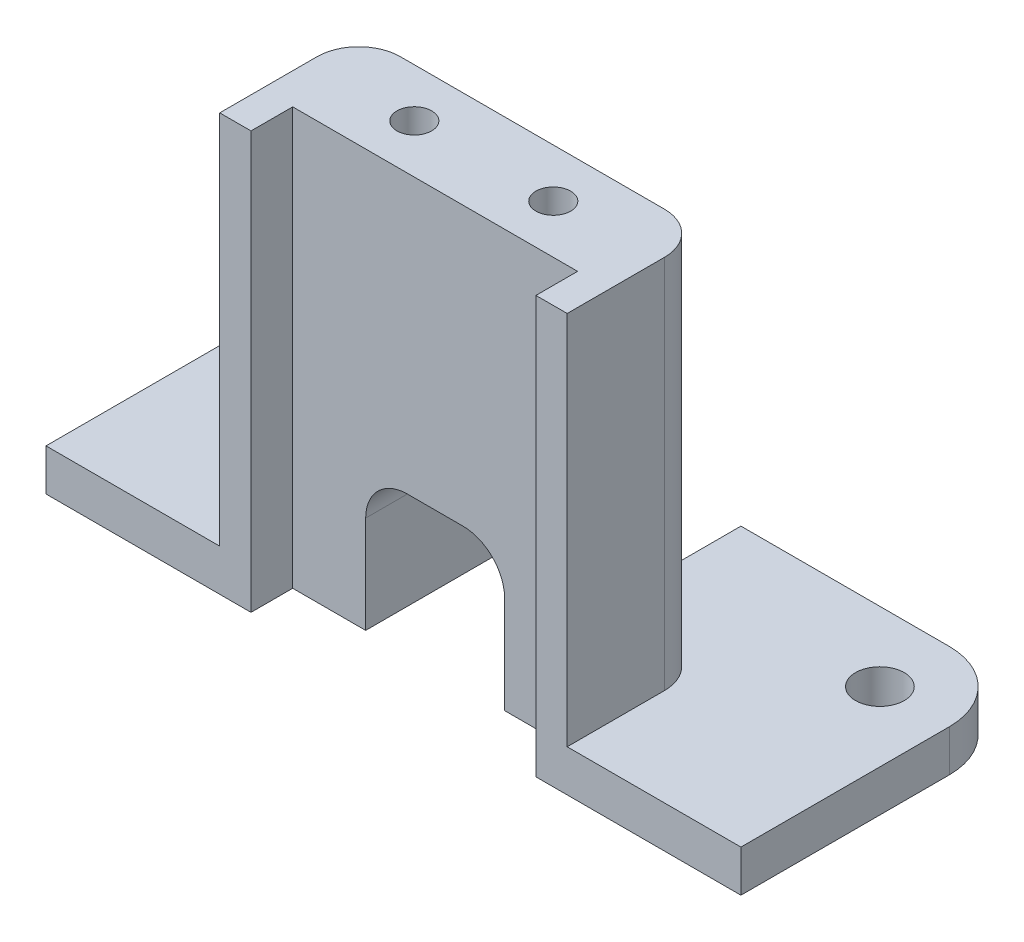
ISO-10303-21;
HEADER;
FILE_DESCRIPTION(('STEP AP214'),'2;1');
FILE_NAME('part.step','',(''),(''),'','','');
FILE_SCHEMA(('AUTOMOTIVE_DESIGN { 1 0 10303 214 1 1 1 1 }'));
ENDSEC;
DATA;
#1=APPLICATION_CONTEXT('core data for automotive mechanical design processes');
#2=APPLICATION_PROTOCOL_DEFINITION('international standard','automotive_design',2000,#1);
#3=PRODUCT_CONTEXT('',#1,'mechanical');
#4=PRODUCT('Part','Part','',(#3));
#5=PRODUCT_RELATED_PRODUCT_CATEGORY('part','',(#4));
#6=PRODUCT_DEFINITION_FORMATION('','',#4);
#7=PRODUCT_DEFINITION_CONTEXT('part definition',#1,'design');
#8=PRODUCT_DEFINITION('design','',#6,#7);
#9=PRODUCT_DEFINITION_SHAPE('','',#8);
#10=(LENGTH_UNIT() NAMED_UNIT(*) SI_UNIT(.MILLI.,.METRE.));
#11=(NAMED_UNIT(*) PLANE_ANGLE_UNIT() SI_UNIT($,.RADIAN.));
#12=(NAMED_UNIT(*) SI_UNIT($,.STERADIAN.) SOLID_ANGLE_UNIT());
#13=UNCERTAINTY_MEASURE_WITH_UNIT(LENGTH_MEASURE(1.E-05),#10,'distance_accuracy_value','');
#14=(GEOMETRIC_REPRESENTATION_CONTEXT(3) GLOBAL_UNCERTAINTY_ASSIGNED_CONTEXT((#13)) GLOBAL_UNIT_ASSIGNED_CONTEXT((#10,
#11,#12)) REPRESENTATION_CONTEXT('',''));
#15=CARTESIAN_POINT('',(0.,0.,0.));
#16=DIRECTION('',(0.,0.,1.));
#17=DIRECTION('',(1.,0.,0.));
#18=AXIS2_PLACEMENT_3D('',#15,#16,#17);
#19=CARTESIAN_POINT('',(0.,0.,0.));
#20=DIRECTION('',(0.,0.,-1.));
#21=DIRECTION('',(-1.,0.,0.));
#22=AXIS2_PLACEMENT_3D('',#19,#20,#21);
#23=PLANE('',#22);
#24=DIRECTION('',(0.,1.,0.));
#25=VECTOR('',#24,1.);
#26=CARTESIAN_POINT('',(7.49999999999999,0.,0.));
#27=LINE('',#26,#25);
#28=CARTESIAN_POINT('',(7.49999999999999,3.,0.));
#29=VERTEX_POINT('',#28);
#30=CARTESIAN_POINT('',(7.49999999999999,7.,0.));
#31=VERTEX_POINT('',#30);
#32=EDGE_CURVE('E346',#29,#31,#27,.T.);
#33=ORIENTED_EDGE('',*,*,#32,.F.);
#34=DIRECTION('',(1.,0.,0.));
#35=VECTOR('',#34,1.);
#36=CARTESIAN_POINT('',(0.,3.,0.));
#37=LINE('',#36,#35);
#38=CARTESIAN_POINT('',(3.,3.,0.));
#39=VERTEX_POINT('',#38);
#40=EDGE_CURVE('E567',#39,#29,#37,.T.);
#41=ORIENTED_EDGE('',*,*,#40,.F.);
#42=DIRECTION('',(0.,-1.,0.));
#43=VECTOR('',#42,1.);
#44=CARTESIAN_POINT('',(2.99999999999999,30.,0.));
#45=LINE('',#44,#43);
#46=CARTESIAN_POINT('',(2.99999999999999,30.,0.));
#47=VERTEX_POINT('',#46);
#48=EDGE_CURVE('E273',#39,#47,#45,.F.);
#49=ORIENTED_EDGE('',*,*,#48,.T.);
#50=DIRECTION('',(-1.,0.,0.));
#51=VECTOR('',#50,1.);
#52=CARTESIAN_POINT('',(0.,30.,0.));
#53=LINE('',#52,#51);
#54=CARTESIAN_POINT('',(22.,30.,0.));
#55=VERTEX_POINT('',#54);
#56=EDGE_CURVE('E231',#55,#47,#53,.T.);
#57=ORIENTED_EDGE('',*,*,#56,.F.);
#58=DIRECTION('',(0.,1.,0.));
#59=VECTOR('',#58,1.);
#60=CARTESIAN_POINT('',(22.,0.,0.));
#61=LINE('',#60,#59);
#62=CARTESIAN_POINT('',(22.,3.,0.));
#63=VERTEX_POINT('',#62);
#64=EDGE_CURVE('E270',#55,#63,#61,.F.);
#65=ORIENTED_EDGE('',*,*,#64,.T.);
#66=DIRECTION('',(-1.,0.,0.));
#67=VECTOR('',#66,1.);
#68=CARTESIAN_POINT('',(0.,3.,0.));
#69=LINE('',#68,#67);
#70=CARTESIAN_POINT('',(17.5,3.,0.));
#71=VERTEX_POINT('',#70);
#72=EDGE_CURVE('E336',#63,#71,#69,.T.);
#73=ORIENTED_EDGE('',*,*,#72,.T.);
#74=DIRECTION('',(0.,-1.,0.));
#75=VECTOR('',#74,1.);
#76=CARTESIAN_POINT('',(17.5,0.,0.));
#77=LINE('',#76,#75);
#78=CARTESIAN_POINT('',(17.5,7.,0.));
#79=VERTEX_POINT('',#78);
#80=EDGE_CURVE('E343',#79,#71,#77,.T.);
#81=ORIENTED_EDGE('',*,*,#80,.F.);
#82=CARTESIAN_POINT('',(14.5,7.,0.));
#83=DIRECTION('',(0.,0.,-1.));
#84=DIRECTION('',(-1.,0.,0.));
#85=AXIS2_PLACEMENT_3D('',#82,#83,#84);
#86=CIRCLE('',#85,3.);
#87=CARTESIAN_POINT('',(14.5,10.,0.));
#88=VERTEX_POINT('',#87);
#89=EDGE_CURVE('E286',#79,#88,#86,.F.);
#90=ORIENTED_EDGE('',*,*,#89,.T.);
#91=DIRECTION('',(1.,0.,0.));
#92=VECTOR('',#91,1.);
#93=CARTESIAN_POINT('',(17.5,10.,0.));
#94=LINE('',#93,#92);
#95=CARTESIAN_POINT('',(10.5,10.,0.));
#96=VERTEX_POINT('',#95);
#97=EDGE_CURVE('E348',#96,#88,#94,.T.);
#98=ORIENTED_EDGE('',*,*,#97,.F.);
#99=CARTESIAN_POINT('',(10.5,7.,0.));
#100=DIRECTION('',(0.,0.,-1.));
#101=DIRECTION('',(-1.,0.,0.));
#102=AXIS2_PLACEMENT_3D('',#99,#100,#101);
#103=CIRCLE('',#102,3.);
#104=EDGE_CURVE('E281',#96,#31,#103,.F.);
#105=ORIENTED_EDGE('',*,*,#104,.T.);
#106=EDGE_LOOP('',(#33,#41,#49,#57,#65,#73,#81,#90,#98,#105));
#107=FACE_BOUND('',#106,.T.);
#108=ADVANCED_FACE('F41',(#107),#23,.T.);
#109=CARTESIAN_POINT('',(0.,0.,10.));
#110=DIRECTION('',(1.,0.,0.));
#111=DIRECTION('',(0.,1.,0.));
#112=AXIS2_PLACEMENT_3D('',#109,#110,#111);
#113=PLANE('',#112);
#114=DIRECTION('',(0.,0.,-1.));
#115=VECTOR('',#114,1.);
#116=CARTESIAN_POINT('',(0.,3.,0.));
#117=LINE('',#116,#115);
#118=CARTESIAN_POINT('',(0.,3.,10.));
#119=VERTEX_POINT('',#118);
#120=CARTESIAN_POINT('',(0.,3.,3.));
#121=VERTEX_POINT('',#120);
#122=EDGE_CURVE('E206',#119,#121,#117,.T.);
#123=ORIENTED_EDGE('',*,*,#122,.F.);
#124=DIRECTION('',(0.,-1.,0.));
#125=VECTOR('',#124,1.);
#126=CARTESIAN_POINT('',(0.,0.,10.));
#127=LINE('',#126,#125);
#128=CARTESIAN_POINT('',(0.,30.,10.));
#129=VERTEX_POINT('',#128);
#130=EDGE_CURVE('E219',#129,#119,#127,.T.);
#131=ORIENTED_EDGE('',*,*,#130,.F.);
#132=DIRECTION('',(0.,0.,-1.));
#133=VECTOR('',#132,1.);
#134=CARTESIAN_POINT('',(0.,30.,10.));
#135=LINE('',#134,#133);
#136=CARTESIAN_POINT('',(0.,30.,3.));
#137=VERTEX_POINT('',#136);
#138=EDGE_CURVE('E246',#129,#137,#135,.T.);
#139=ORIENTED_EDGE('',*,*,#138,.T.);
#140=DIRECTION('',(0.,-1.,0.));
#141=VECTOR('',#140,1.);
#142=CARTESIAN_POINT('',(0.,0.,3.));
#143=LINE('',#142,#141);
#144=EDGE_CURVE('E221',#137,#121,#143,.T.);
#145=ORIENTED_EDGE('',*,*,#144,.T.);
#146=EDGE_LOOP('',(#123,#131,#139,#145));
#147=FACE_BOUND('',#146,.T.);
#148=ADVANCED_FACE('F217',(#147),#113,.F.);
#149=CARTESIAN_POINT('',(3.,0.,3.));
#150=DIRECTION('',(0.,1.,0.));
#151=DIRECTION('',(-1.,0.,0.));
#152=AXIS2_PLACEMENT_3D('',#149,#150,#151);
#153=CYLINDRICAL_SURFACE('',#152,3.);
#154=ORIENTED_EDGE('',*,*,#48,.F.);
#155=CARTESIAN_POINT('',(3.,3.,3.));
#156=DIRECTION('',(0.,-1.,0.));
#157=DIRECTION('',(0.,0.,-1.));
#158=AXIS2_PLACEMENT_3D('',#155,#156,#157);
#159=CIRCLE('',#158,3.);
#160=EDGE_CURVE('E399',#121,#39,#159,.T.);
#161=ORIENTED_EDGE('',*,*,#160,.F.);
#162=ORIENTED_EDGE('',*,*,#144,.F.);
#163=CARTESIAN_POINT('',(2.99999999999999,30.,3.));
#164=DIRECTION('',(0.,-1.,0.));
#165=DIRECTION('',(0.,0.,-1.));
#166=AXIS2_PLACEMENT_3D('',#163,#164,#165);
#167=CIRCLE('',#166,3.);
#168=EDGE_CURVE('E277',#47,#137,#167,.F.);
#169=ORIENTED_EDGE('',*,*,#168,.F.);
#170=EDGE_LOOP('',(#154,#161,#162,#169));
#171=FACE_BOUND('',#170,.T.);
#172=ADVANCED_FACE('F439',(#171),#153,.T.);
#173=CARTESIAN_POINT('',(25.,0.,10.));
#174=DIRECTION('',(-1.,0.,0.));
#175=DIRECTION('',(0.,-1.,0.));
#176=AXIS2_PLACEMENT_3D('',#173,#174,#175);
#177=PLANE('',#176);
#178=DIRECTION('',(0.,0.,1.));
#179=VECTOR('',#178,1.);
#180=CARTESIAN_POINT('',(25.,3.,10.));
#181=LINE('',#180,#179);
#182=CARTESIAN_POINT('',(25.,3.,3.));
#183=VERTEX_POINT('',#182);
#184=CARTESIAN_POINT('',(25.,3.,10.));
#185=VERTEX_POINT('',#184);
#186=EDGE_CURVE('E341',#183,#185,#181,.T.);
#187=ORIENTED_EDGE('',*,*,#186,.F.);
#188=DIRECTION('',(0.,1.,0.));
#189=VECTOR('',#188,1.);
#190=CARTESIAN_POINT('',(25.,30.,3.));
#191=LINE('',#190,#189);
#192=CARTESIAN_POINT('',(25.,30.,3.));
#193=VERTEX_POINT('',#192);
#194=EDGE_CURVE('E279',#183,#193,#191,.T.);
#195=ORIENTED_EDGE('',*,*,#194,.T.);
#196=DIRECTION('',(0.,0.,-1.));
#197=VECTOR('',#196,1.);
#198=CARTESIAN_POINT('',(25.,30.,10.));
#199=LINE('',#198,#197);
#200=CARTESIAN_POINT('',(25.,30.,10.));
#201=VERTEX_POINT('',#200);
#202=EDGE_CURVE('E249',#201,#193,#199,.T.);
#203=ORIENTED_EDGE('',*,*,#202,.F.);
#204=DIRECTION('',(0.,1.,0.));
#205=VECTOR('',#204,1.);
#206=CARTESIAN_POINT('',(25.,0.,10.));
#207=LINE('',#206,#205);
#208=EDGE_CURVE('E242',#185,#201,#207,.T.);
#209=ORIENTED_EDGE('',*,*,#208,.F.);
#210=EDGE_LOOP('',(#187,#195,#203,#209));
#211=FACE_BOUND('',#210,.T.);
#212=ADVANCED_FACE('F450',(#211),#177,.F.);
#213=CARTESIAN_POINT('',(22.,0.,3.));
#214=DIRECTION('',(0.,-1.,0.));
#215=DIRECTION('',(1.,0.,0.));
#216=AXIS2_PLACEMENT_3D('',#213,#214,#215);
#217=CYLINDRICAL_SURFACE('',#216,3.);
#218=ORIENTED_EDGE('',*,*,#194,.F.);
#219=CARTESIAN_POINT('',(22.,3.,3.));
#220=DIRECTION('',(0.,-1.,0.));
#221=DIRECTION('',(0.,0.,-1.));
#222=AXIS2_PLACEMENT_3D('',#219,#220,#221);
#223=CIRCLE('',#222,3.);
#224=EDGE_CURVE('E291',#183,#63,#223,.F.);
#225=ORIENTED_EDGE('',*,*,#224,.T.);
#226=ORIENTED_EDGE('',*,*,#64,.F.);
#227=CARTESIAN_POINT('',(22.,30.,3.));
#228=DIRECTION('',(0.,-1.,0.));
#229=DIRECTION('',(0.,0.,-1.));
#230=AXIS2_PLACEMENT_3D('',#227,#228,#229);
#231=CIRCLE('',#230,3.);
#232=EDGE_CURVE('E275',#193,#55,#231,.F.);
#233=ORIENTED_EDGE('',*,*,#232,.F.);
#234=EDGE_LOOP('',(#218,#225,#226,#233));
#235=FACE_BOUND('',#234,.T.);
#236=ADVANCED_FACE('F453',(#235),#217,.T.);
#237=CARTESIAN_POINT('',(0.,0.,10.));
#238=DIRECTION('',(0.,1.,0.));
#239=DIRECTION('',(0.,0.,1.));
#240=AXIS2_PLACEMENT_3D('',#237,#238,#239);
#241=PLANE('',#240);
#242=CARTESIAN_POINT('',(32.5,0.,-5.));
#243=DIRECTION('',(0.,1.,0.));
#244=DIRECTION('',(0.,0.,1.));
#245=AXIS2_PLACEMENT_3D('',#242,#243,#244);
#246=CIRCLE('',#245,1.75);
#247=CARTESIAN_POINT('',(32.5,0.,-3.25));
#248=VERTEX_POINT('',#247);
#249=EDGE_CURVE('E404',#248,#248,#246,.T.);
#250=ORIENTED_EDGE('',*,*,#249,.T.);
#251=EDGE_LOOP('',(#250));
#252=FACE_BOUND('',#251,.T.);
#253=DIRECTION('',(1.,0.,0.));
#254=VECTOR('',#253,1.);
#255=CARTESIAN_POINT('',(0.,0.,-10.));
#256=LINE('',#255,#254);
#257=CARTESIAN_POINT('',(17.5,0.,-10.));
#258=VERTEX_POINT('',#257);
#259=CARTESIAN_POINT('',(32.5,0.,-10.));
#260=VERTEX_POINT('',#259);
#261=EDGE_CURVE('E312',#258,#260,#256,.T.);
#262=ORIENTED_EDGE('',*,*,#261,.T.);
#263=CARTESIAN_POINT('',(32.5,0.,-5.));
#264=DIRECTION('',(0.,1.,0.));
#265=DIRECTION('',(0.,0.,1.));
#266=AXIS2_PLACEMENT_3D('',#263,#264,#265);
#267=CIRCLE('',#266,5.);
#268=CARTESIAN_POINT('',(37.5,0.,-5.));
#269=VERTEX_POINT('',#268);
#270=EDGE_CURVE('E63',#260,#269,#267,.F.);
#271=ORIENTED_EDGE('',*,*,#270,.T.);
#272=DIRECTION('',(0.,0.,-1.));
#273=VECTOR('',#272,1.);
#274=CARTESIAN_POINT('',(37.5,0.,0.));
#275=LINE('',#274,#273);
#276=CARTESIAN_POINT('',(37.5,0.,10.));
#277=VERTEX_POINT('',#276);
#278=EDGE_CURVE('E321',#277,#269,#275,.T.);
#279=ORIENTED_EDGE('',*,*,#278,.F.);
#280=DIRECTION('',(1.,0.,0.));
#281=VECTOR('',#280,1.);
#282=CARTESIAN_POINT('',(0.,0.,10.));
#283=LINE('',#282,#281);
#284=CARTESIAN_POINT('',(22.75,0.,10.));
#285=VERTEX_POINT('',#284);
#286=EDGE_CURVE('E230',#285,#277,#283,.T.);
#287=ORIENTED_EDGE('',*,*,#286,.F.);
#288=DIRECTION('',(0.,0.,1.));
#289=VECTOR('',#288,1.);
#290=CARTESIAN_POINT('',(22.75,0.,7.));
#291=LINE('',#290,#289);
#292=CARTESIAN_POINT('',(22.75,0.,7.));
#293=VERTEX_POINT('',#292);
#294=EDGE_CURVE('E385',#293,#285,#291,.T.);
#295=ORIENTED_EDGE('',*,*,#294,.F.);
#296=DIRECTION('',(1.,0.,0.));
#297=VECTOR('',#296,1.);
#298=CARTESIAN_POINT('',(2.24999999999999,0.,7.));
#299=LINE('',#298,#297);
#300=CARTESIAN_POINT('',(17.5,0.,7.));
#301=VERTEX_POINT('',#300);
#302=EDGE_CURVE('E370',#301,#293,#299,.T.);
#303=ORIENTED_EDGE('',*,*,#302,.F.);
#304=DIRECTION('',(0.,0.,-1.));
#305=VECTOR('',#304,1.);
#306=CARTESIAN_POINT('',(17.5,0.,12.));
#307=LINE('',#306,#305);
#308=EDGE_CURVE('E319',#301,#258,#307,.T.);
#309=ORIENTED_EDGE('',*,*,#308,.T.);
#310=EDGE_LOOP('',(#262,#271,#279,#287,#295,#303,#309));
#311=FACE_BOUND('',#310,.T.);
#312=ADVANCED_FACE('F317',(#252,#311),#241,.F.);
#313=CARTESIAN_POINT('',(0.,0.,10.));
#314=DIRECTION('',(0.,0.,-1.));
#315=DIRECTION('',(-1.,0.,0.));
#316=AXIS2_PLACEMENT_3D('',#313,#314,#315);
#317=PLANE('',#316);
#318=CARTESIAN_POINT('',(-12.5,0.,10.));
#319=VERTEX_POINT('',#318);
#320=CARTESIAN_POINT('',(2.24999999999999,0.,10.));
#321=VERTEX_POINT('',#320);
#322=EDGE_CURVE('E233',#319,#321,#283,.T.);
#323=ORIENTED_EDGE('',*,*,#322,.T.);
#324=DIRECTION('',(0.,-1.,0.));
#325=VECTOR('',#324,1.);
#326=CARTESIAN_POINT('',(2.24999999999999,30.,10.));
#327=LINE('',#326,#325);
#328=CARTESIAN_POINT('',(2.24999999999999,30.,10.));
#329=VERTEX_POINT('',#328);
#330=EDGE_CURVE('E358',#329,#321,#327,.T.);
#331=ORIENTED_EDGE('',*,*,#330,.F.);
#332=DIRECTION('',(-1.,0.,0.));
#333=VECTOR('',#332,1.);
#334=CARTESIAN_POINT('',(0.,30.,10.));
#335=LINE('',#334,#333);
#336=EDGE_CURVE('E228',#329,#129,#335,.T.);
#337=ORIENTED_EDGE('',*,*,#336,.T.);
#338=ORIENTED_EDGE('',*,*,#130,.T.);
#339=DIRECTION('',(-1.,0.,0.));
#340=VECTOR('',#339,1.);
#341=CARTESIAN_POINT('',(0.,3.,10.));
#342=LINE('',#341,#340);
#343=CARTESIAN_POINT('',(-12.5,3.,10.));
#344=VERTEX_POINT('',#343);
#345=EDGE_CURVE('E202',#119,#344,#342,.T.);
#346=ORIENTED_EDGE('',*,*,#345,.T.);
#347=DIRECTION('',(0.,-1.,0.));
#348=VECTOR('',#347,1.);
#349=CARTESIAN_POINT('',(-12.5,3.,10.));
#350=LINE('',#349,#348);
#351=EDGE_CURVE('E327',#344,#319,#350,.T.);
#352=ORIENTED_EDGE('',*,*,#351,.T.);
#353=EDGE_LOOP('',(#323,#331,#337,#338,#346,#352));
#354=FACE_BOUND('',#353,.T.);
#355=ADVANCED_FACE('F225',(#354),#317,.F.);
#356=CARTESIAN_POINT('',(-7.50000000000001,0.,-5.));
#357=DIRECTION('',(0.,1.,0.));
#358=DIRECTION('',(0.,0.,1.));
#359=AXIS2_PLACEMENT_3D('',#356,#357,#358);
#360=CIRCLE('',#359,1.75);
#361=CARTESIAN_POINT('',(-7.50000000000001,0.,-3.25));
#362=VERTEX_POINT('',#361);
#363=EDGE_CURVE('E558',#362,#362,#360,.T.);
#364=ORIENTED_EDGE('',*,*,#363,.T.);
#365=EDGE_LOOP('',(#364));
#366=FACE_BOUND('',#365,.T.);
#367=DIRECTION('',(0.,0.,-1.));
#368=VECTOR('',#367,1.);
#369=CARTESIAN_POINT('',(-12.5,0.,0.));
#370=LINE('',#369,#368);
#371=CARTESIAN_POINT('',(-12.5,0.,-5.));
#372=VERTEX_POINT('',#371);
#373=EDGE_CURVE('E401',#319,#372,#370,.T.);
#374=ORIENTED_EDGE('',*,*,#373,.T.);
#375=CARTESIAN_POINT('',(-7.50000000000001,0.,-5.));
#376=DIRECTION('',(0.,1.,0.));
#377=DIRECTION('',(0.,0.,1.));
#378=AXIS2_PLACEMENT_3D('',#375,#376,#377);
#379=CIRCLE('',#378,5.);
#380=CARTESIAN_POINT('',(-7.50000000000001,0.,-10.));
#381=VERTEX_POINT('',#380);
#382=EDGE_CURVE('E297',#372,#381,#379,.F.);
#383=ORIENTED_EDGE('',*,*,#382,.T.);
#384=DIRECTION('',(-1.,0.,0.));
#385=VECTOR('',#384,1.);
#386=CARTESIAN_POINT('',(0.,0.,-10.));
#387=LINE('',#386,#385);
#388=CARTESIAN_POINT('',(7.49999999999999,0.,-10.));
#389=VERTEX_POINT('',#388);
#390=EDGE_CURVE('E222',#389,#381,#387,.T.);
#391=ORIENTED_EDGE('',*,*,#390,.F.);
#392=DIRECTION('',(0.,0.,-1.));
#393=VECTOR('',#392,1.);
#394=CARTESIAN_POINT('',(7.49999999999999,0.,12.));
#395=LINE('',#394,#393);
#396=CARTESIAN_POINT('',(7.49999999999999,0.,7.));
#397=VERTEX_POINT('',#396);
#398=EDGE_CURVE('E351',#397,#389,#395,.T.);
#399=ORIENTED_EDGE('',*,*,#398,.F.);
#400=CARTESIAN_POINT('',(2.24999999999999,0.,7.));
#401=VERTEX_POINT('',#400);
#402=EDGE_CURVE('E372',#401,#397,#299,.T.);
#403=ORIENTED_EDGE('',*,*,#402,.F.);
#404=DIRECTION('',(0.,0.,1.));
#405=VECTOR('',#404,1.);
#406=CARTESIAN_POINT('',(2.24999999999999,0.,7.));
#407=LINE('',#406,#405);
#408=EDGE_CURVE('E239',#401,#321,#407,.T.);
#409=ORIENTED_EDGE('',*,*,#408,.T.);
#410=ORIENTED_EDGE('',*,*,#322,.F.);
#411=EDGE_LOOP('',(#374,#383,#391,#399,#403,#409,#410));
#412=FACE_BOUND('',#411,.T.);
#413=ADVANCED_FACE('F394',(#366,#412),#241,.F.);
#414=CARTESIAN_POINT('',(0.,30.,10.));
#415=DIRECTION('',(0.,-1.,0.));
#416=DIRECTION('',(0.,0.,-1.));
#417=AXIS2_PLACEMENT_3D('',#414,#415,#416);
#418=PLANE('',#417);
#419=CARTESIAN_POINT('',(7.49999999999999,30.,3.5));
#420=DIRECTION('',(0.,1.,0.));
#421=DIRECTION('',(0.,0.,1.));
#422=AXIS2_PLACEMENT_3D('',#419,#420,#421);
#423=CIRCLE('',#422,1.25);
#424=CARTESIAN_POINT('',(7.49999999999999,30.,4.75));
#425=VERTEX_POINT('',#424);
#426=EDGE_CURVE('E359',#425,#425,#423,.T.);
#427=ORIENTED_EDGE('',*,*,#426,.F.);
#428=EDGE_LOOP('',(#427));
#429=FACE_BOUND('',#428,.T.);
#430=CARTESIAN_POINT('',(17.5,30.,3.5));
#431=DIRECTION('',(0.,1.,0.));
#432=DIRECTION('',(0.,0.,1.));
#433=AXIS2_PLACEMENT_3D('',#430,#431,#432);
#434=CIRCLE('',#433,1.25);
#435=CARTESIAN_POINT('',(17.5,30.,4.75));
#436=VERTEX_POINT('',#435);
#437=EDGE_CURVE('E362',#436,#436,#434,.T.);
#438=ORIENTED_EDGE('',*,*,#437,.F.);
#439=EDGE_LOOP('',(#438));
#440=FACE_BOUND('',#439,.T.);
#441=ORIENTED_EDGE('',*,*,#56,.T.);
#442=ORIENTED_EDGE('',*,*,#168,.T.);
#443=ORIENTED_EDGE('',*,*,#138,.F.);
#444=ORIENTED_EDGE('',*,*,#336,.F.);
#445=DIRECTION('',(0.,0.,1.));
#446=VECTOR('',#445,1.);
#447=CARTESIAN_POINT('',(2.24999999999999,30.,7.));
#448=LINE('',#447,#446);
#449=CARTESIAN_POINT('',(2.24999999999999,30.,7.));
#450=VERTEX_POINT('',#449);
#451=EDGE_CURVE('E236',#450,#329,#448,.T.);
#452=ORIENTED_EDGE('',*,*,#451,.F.);
#453=DIRECTION('',(-1.,0.,0.));
#454=VECTOR('',#453,1.);
#455=CARTESIAN_POINT('',(2.24999999999999,30.,7.));
#456=LINE('',#455,#454);
#457=CARTESIAN_POINT('',(22.75,30.,7.));
#458=VERTEX_POINT('',#457);
#459=EDGE_CURVE('E377',#458,#450,#456,.T.);
#460=ORIENTED_EDGE('',*,*,#459,.F.);
#461=DIRECTION('',(0.,0.,1.));
#462=VECTOR('',#461,1.);
#463=CARTESIAN_POINT('',(22.75,30.,7.));
#464=LINE('',#463,#462);
#465=CARTESIAN_POINT('',(22.75,30.,10.));
#466=VERTEX_POINT('',#465);
#467=EDGE_CURVE('E383',#458,#466,#464,.T.);
#468=ORIENTED_EDGE('',*,*,#467,.T.);
#469=EDGE_CURVE('E244',#201,#466,#335,.T.);
#470=ORIENTED_EDGE('',*,*,#469,.F.);
#471=ORIENTED_EDGE('',*,*,#202,.T.);
#472=ORIENTED_EDGE('',*,*,#232,.T.);
#473=EDGE_LOOP('',(#441,#442,#443,#444,#452,#460,#468,#470,#471,#472));
#474=FACE_BOUND('',#473,.T.);
#475=ADVANCED_FACE('F446',(#429,#440,#474),#418,.F.);
#476=ORIENTED_EDGE('',*,*,#286,.T.);
#477=DIRECTION('',(0.,-1.,0.));
#478=VECTOR('',#477,1.);
#479=CARTESIAN_POINT('',(37.5,3.,10.));
#480=LINE('',#479,#478);
#481=CARTESIAN_POINT('',(37.5,3.,10.));
#482=VERTEX_POINT('',#481);
#483=EDGE_CURVE('E333',#482,#277,#480,.T.);
#484=ORIENTED_EDGE('',*,*,#483,.F.);
#485=DIRECTION('',(1.,0.,0.));
#486=VECTOR('',#485,1.);
#487=CARTESIAN_POINT('',(0.,3.,10.));
#488=LINE('',#487,#486);
#489=EDGE_CURVE('E324',#185,#482,#488,.T.);
#490=ORIENTED_EDGE('',*,*,#489,.F.);
#491=ORIENTED_EDGE('',*,*,#208,.T.);
#492=ORIENTED_EDGE('',*,*,#469,.T.);
#493=DIRECTION('',(0.,1.,0.));
#494=VECTOR('',#493,1.);
#495=CARTESIAN_POINT('',(22.75,30.,10.));
#496=LINE('',#495,#494);
#497=EDGE_CURVE('E371',#285,#466,#496,.T.);
#498=ORIENTED_EDGE('',*,*,#497,.F.);
#499=EDGE_LOOP('',(#476,#484,#490,#491,#492,#498));
#500=FACE_BOUND('',#499,.T.);
#501=ADVANCED_FACE('F444',(#500),#317,.F.);
#502=CARTESIAN_POINT('',(2.24999999999999,30.,7.));
#503=DIRECTION('',(-1.,0.,0.));
#504=DIRECTION('',(0.,-1.,0.));
#505=AXIS2_PLACEMENT_3D('',#502,#503,#504);
#506=PLANE('',#505);
#507=ORIENTED_EDGE('',*,*,#330,.T.);
#508=ORIENTED_EDGE('',*,*,#408,.F.);
#509=DIRECTION('',(0.,-1.,0.));
#510=VECTOR('',#509,1.);
#511=CARTESIAN_POINT('',(2.24999999999999,30.,7.));
#512=LINE('',#511,#510);
#513=EDGE_CURVE('E367',#450,#401,#512,.T.);
#514=ORIENTED_EDGE('',*,*,#513,.F.);
#515=ORIENTED_EDGE('',*,*,#451,.T.);
#516=EDGE_LOOP('',(#507,#508,#514,#515));
#517=FACE_BOUND('',#516,.T.);
#518=ADVANCED_FACE('F494',(#517),#506,.F.);
#519=CARTESIAN_POINT('',(22.75,30.,7.));
#520=DIRECTION('',(1.,0.,0.));
#521=DIRECTION('',(0.,0.,-1.));
#522=AXIS2_PLACEMENT_3D('',#519,#520,#521);
#523=PLANE('',#522);
#524=ORIENTED_EDGE('',*,*,#497,.T.);
#525=ORIENTED_EDGE('',*,*,#467,.F.);
#526=DIRECTION('',(0.,1.,0.));
#527=VECTOR('',#526,1.);
#528=CARTESIAN_POINT('',(22.75,30.,7.));
#529=LINE('',#528,#527);
#530=EDGE_CURVE('E375',#293,#458,#529,.T.);
#531=ORIENTED_EDGE('',*,*,#530,.F.);
#532=ORIENTED_EDGE('',*,*,#294,.T.);
#533=EDGE_LOOP('',(#524,#525,#531,#532));
#534=FACE_BOUND('',#533,.T.);
#535=ADVANCED_FACE('F489',(#534),#523,.F.);
#536=CARTESIAN_POINT('',(0.,0.,7.));
#537=DIRECTION('',(0.,0.,1.));
#538=DIRECTION('',(1.,0.,0.));
#539=AXIS2_PLACEMENT_3D('',#536,#537,#538);
#540=PLANE('',#539);
#541=ORIENTED_EDGE('',*,*,#530,.T.);
#542=ORIENTED_EDGE('',*,*,#459,.T.);
#543=ORIENTED_EDGE('',*,*,#513,.T.);
#544=ORIENTED_EDGE('',*,*,#402,.T.);
#545=DIRECTION('',(0.,-1.,0.));
#546=VECTOR('',#545,1.);
#547=CARTESIAN_POINT('',(7.49999999999999,0.,7.));
#548=LINE('',#547,#546);
#549=CARTESIAN_POINT('',(7.49999999999999,7.,7.));
#550=VERTEX_POINT('',#549);
#551=EDGE_CURVE('E252',#550,#397,#548,.T.);
#552=ORIENTED_EDGE('',*,*,#551,.F.);
#553=CARTESIAN_POINT('',(10.5,7.,7.));
#554=DIRECTION('',(0.,0.,1.));
#555=DIRECTION('',(1.,0.,0.));
#556=AXIS2_PLACEMENT_3D('',#553,#554,#555);
#557=CIRCLE('',#556,3.);
#558=CARTESIAN_POINT('',(10.5,10.,7.));
#559=VERTEX_POINT('',#558);
#560=EDGE_CURVE('E284',#550,#559,#557,.F.);
#561=ORIENTED_EDGE('',*,*,#560,.T.);
#562=DIRECTION('',(-1.,0.,0.));
#563=VECTOR('',#562,1.);
#564=CARTESIAN_POINT('',(0.,10.,7.));
#565=LINE('',#564,#563);
#566=CARTESIAN_POINT('',(14.5,10.,7.));
#567=VERTEX_POINT('',#566);
#568=EDGE_CURVE('E254',#567,#559,#565,.T.);
#569=ORIENTED_EDGE('',*,*,#568,.F.);
#570=CARTESIAN_POINT('',(14.5,7.,7.));
#571=DIRECTION('',(0.,0.,1.));
#572=DIRECTION('',(1.,0.,0.));
#573=AXIS2_PLACEMENT_3D('',#570,#571,#572);
#574=CIRCLE('',#573,3.);
#575=CARTESIAN_POINT('',(17.5,7.,7.));
#576=VERTEX_POINT('',#575);
#577=EDGE_CURVE('E288',#567,#576,#574,.F.);
#578=ORIENTED_EDGE('',*,*,#577,.T.);
#579=DIRECTION('',(0.,1.,0.));
#580=VECTOR('',#579,1.);
#581=CARTESIAN_POINT('',(17.5,0.,7.));
#582=LINE('',#581,#580);
#583=EDGE_CURVE('E257',#301,#576,#582,.T.);
#584=ORIENTED_EDGE('',*,*,#583,.F.);
#585=ORIENTED_EDGE('',*,*,#302,.T.);
#586=EDGE_LOOP('',(#541,#542,#543,#544,#552,#561,#569,#578,#584,#585));
#587=FACE_BOUND('',#586,.T.);
#588=ADVANCED_FACE('F487',(#587),#540,.T.);
#589=CARTESIAN_POINT('',(17.5,18.,3.5));
#590=DIRECTION('',(0.,1.,0.));
#591=DIRECTION('',(0.,0.,1.));
#592=AXIS2_PLACEMENT_3D('',#589,#590,#591);
#593=CYLINDRICAL_SURFACE('',#592,1.25);
#594=CARTESIAN_POINT('',(17.5,18.,3.5));
#595=DIRECTION('',(0.,1.,0.));
#596=DIRECTION('',(0.,0.,1.));
#597=AXIS2_PLACEMENT_3D('',#594,#595,#596);
#598=CIRCLE('',#597,1.25);
#599=CARTESIAN_POINT('',(17.5,18.,4.75));
#600=VERTEX_POINT('',#599);
#601=EDGE_CURVE('E353',#600,#600,#598,.T.);
#602=ORIENTED_EDGE('',*,*,#601,.F.);
#603=EDGE_LOOP('',(#602));
#604=FACE_BOUND('',#603,.T.);
#605=ORIENTED_EDGE('',*,*,#437,.T.);
#606=EDGE_LOOP('',(#605));
#607=FACE_BOUND('',#606,.T.);
#608=ADVANCED_FACE('F505',(#604,#607),#593,.F.);
#609=CARTESIAN_POINT('',(17.5,18.,3.5));
#610=DIRECTION('',(0.,1.,0.));
#611=DIRECTION('',(0.,0.,1.));
#612=AXIS2_PLACEMENT_3D('',#609,#610,#611);
#613=PLANE('',#612);
#614=ORIENTED_EDGE('',*,*,#601,.T.);
#615=EDGE_LOOP('',(#614));
#616=FACE_BOUND('',#615,.T.);
#617=ADVANCED_FACE('F506',(#616),#613,.T.);
#618=CARTESIAN_POINT('',(7.49999999999999,18.,3.5));
#619=DIRECTION('',(0.,1.,0.));
#620=DIRECTION('',(0.,0.,1.));
#621=AXIS2_PLACEMENT_3D('',#618,#619,#620);
#622=CYLINDRICAL_SURFACE('',#621,1.25);
#623=CARTESIAN_POINT('',(7.49999999999999,18.,3.5));
#624=DIRECTION('',(0.,1.,0.));
#625=DIRECTION('',(0.,0.,1.));
#626=AXIS2_PLACEMENT_3D('',#623,#624,#625);
#627=CIRCLE('',#626,1.25);
#628=CARTESIAN_POINT('',(7.49999999999999,18.,4.75));
#629=VERTEX_POINT('',#628);
#630=EDGE_CURVE('E355',#629,#629,#627,.T.);
#631=ORIENTED_EDGE('',*,*,#630,.F.);
#632=EDGE_LOOP('',(#631));
#633=FACE_BOUND('',#632,.T.);
#634=ORIENTED_EDGE('',*,*,#426,.T.);
#635=EDGE_LOOP('',(#634));
#636=FACE_BOUND('',#635,.T.);
#637=ADVANCED_FACE('F509',(#633,#636),#622,.F.);
#638=CARTESIAN_POINT('',(7.49999999999999,18.,3.5));
#639=DIRECTION('',(0.,1.,0.));
#640=DIRECTION('',(0.,0.,1.));
#641=AXIS2_PLACEMENT_3D('',#638,#639,#640);
#642=PLANE('',#641);
#643=ORIENTED_EDGE('',*,*,#630,.T.);
#644=EDGE_LOOP('',(#643));
#645=FACE_BOUND('',#644,.T.);
#646=ADVANCED_FACE('F515',(#645),#642,.T.);
#647=CARTESIAN_POINT('',(17.5,0.,12.));
#648=DIRECTION('',(1.,0.,0.));
#649=DIRECTION('',(0.,1.,0.));
#650=AXIS2_PLACEMENT_3D('',#647,#648,#649);
#651=PLANE('',#650);
#652=ORIENTED_EDGE('',*,*,#583,.T.);
#653=DIRECTION('',(0.,0.,-1.));
#654=VECTOR('',#653,1.);
#655=CARTESIAN_POINT('',(17.5,7.,0.));
#656=LINE('',#655,#654);
#657=EDGE_CURVE('E266',#576,#79,#656,.T.);
#658=ORIENTED_EDGE('',*,*,#657,.T.);
#659=ORIENTED_EDGE('',*,*,#80,.T.);
#660=DIRECTION('',(0.,0.,-1.));
#661=VECTOR('',#660,1.);
#662=CARTESIAN_POINT('',(17.5,3.,0.));
#663=LINE('',#662,#661);
#664=CARTESIAN_POINT('',(17.5,3.,-10.));
#665=VERTEX_POINT('',#664);
#666=EDGE_CURVE('E415',#71,#665,#663,.T.);
#667=ORIENTED_EDGE('',*,*,#666,.T.);
#668=DIRECTION('',(0.,-1.,0.));
#669=VECTOR('',#668,1.);
#670=CARTESIAN_POINT('',(17.5,3.,-10.));
#671=LINE('',#670,#669);
#672=EDGE_CURVE('E337',#665,#258,#671,.T.);
#673=ORIENTED_EDGE('',*,*,#672,.T.);
#674=ORIENTED_EDGE('',*,*,#308,.F.);
#675=EDGE_LOOP('',(#652,#658,#659,#667,#673,#674));
#676=FACE_BOUND('',#675,.T.);
#677=ADVANCED_FACE('F519',(#676),#651,.F.);
#678=CARTESIAN_POINT('',(17.5,10.,12.));
#679=DIRECTION('',(0.,1.,0.));
#680=DIRECTION('',(0.,0.,1.));
#681=AXIS2_PLACEMENT_3D('',#678,#679,#680);
#682=PLANE('',#681);
#683=ORIENTED_EDGE('',*,*,#568,.T.);
#684=DIRECTION('',(0.,0.,-1.));
#685=VECTOR('',#684,1.);
#686=CARTESIAN_POINT('',(10.5,10.,0.));
#687=LINE('',#686,#685);
#688=EDGE_CURVE('E261',#559,#96,#687,.T.);
#689=ORIENTED_EDGE('',*,*,#688,.T.);
#690=ORIENTED_EDGE('',*,*,#97,.T.);
#691=DIRECTION('',(0.,0.,-1.));
#692=VECTOR('',#691,1.);
#693=CARTESIAN_POINT('',(14.5,10.,7.));
#694=LINE('',#693,#692);
#695=EDGE_CURVE('E259',#88,#567,#694,.F.);
#696=ORIENTED_EDGE('',*,*,#695,.T.);
#697=EDGE_LOOP('',(#683,#689,#690,#696));
#698=FACE_BOUND('',#697,.T.);
#699=ADVANCED_FACE('F523',(#698),#682,.F.);
#700=CARTESIAN_POINT('',(7.49999999999999,0.,12.));
#701=DIRECTION('',(-1.,0.,0.));
#702=DIRECTION('',(0.,-1.,0.));
#703=AXIS2_PLACEMENT_3D('',#700,#701,#702);
#704=PLANE('',#703);
#705=ORIENTED_EDGE('',*,*,#398,.T.);
#706=DIRECTION('',(0.,-1.,0.));
#707=VECTOR('',#706,1.);
#708=CARTESIAN_POINT('',(7.49999999999999,3.,-10.));
#709=LINE('',#708,#707);
#710=CARTESIAN_POINT('',(7.49999999999999,3.,-10.));
#711=VERTEX_POINT('',#710);
#712=EDGE_CURVE('E322',#711,#389,#709,.T.);
#713=ORIENTED_EDGE('',*,*,#712,.F.);
#714=DIRECTION('',(0.,0.,-1.));
#715=VECTOR('',#714,1.);
#716=CARTESIAN_POINT('',(7.49999999999999,3.,0.));
#717=LINE('',#716,#715);
#718=EDGE_CURVE('E566',#29,#711,#717,.T.);
#719=ORIENTED_EDGE('',*,*,#718,.F.);
#720=ORIENTED_EDGE('',*,*,#32,.T.);
#721=DIRECTION('',(0.,0.,-1.));
#722=VECTOR('',#721,1.);
#723=CARTESIAN_POINT('',(7.49999999999999,7.,7.));
#724=LINE('',#723,#722);
#725=EDGE_CURVE('E264',#31,#550,#724,.F.);
#726=ORIENTED_EDGE('',*,*,#725,.T.);
#727=ORIENTED_EDGE('',*,*,#551,.T.);
#728=EDGE_LOOP('',(#705,#713,#719,#720,#726,#727));
#729=FACE_BOUND('',#728,.T.);
#730=ADVANCED_FACE('F462',(#729),#704,.F.);
#731=CARTESIAN_POINT('',(10.5,7.,12.));
#732=DIRECTION('',(0.,0.,1.));
#733=DIRECTION('',(1.,0.,0.));
#734=AXIS2_PLACEMENT_3D('',#731,#732,#733);
#735=CYLINDRICAL_SURFACE('',#734,3.);
#736=ORIENTED_EDGE('',*,*,#560,.F.);
#737=ORIENTED_EDGE('',*,*,#725,.F.);
#738=ORIENTED_EDGE('',*,*,#104,.F.);
#739=ORIENTED_EDGE('',*,*,#688,.F.);
#740=EDGE_LOOP('',(#736,#737,#738,#739));
#741=FACE_BOUND('',#740,.T.);
#742=ADVANCED_FACE('F458',(#741),#735,.F.);
#743=CARTESIAN_POINT('',(14.5,7.,12.));
#744=DIRECTION('',(0.,0.,1.));
#745=DIRECTION('',(1.,0.,0.));
#746=AXIS2_PLACEMENT_3D('',#743,#744,#745);
#747=CYLINDRICAL_SURFACE('',#746,3.);
#748=ORIENTED_EDGE('',*,*,#577,.F.);
#749=ORIENTED_EDGE('',*,*,#695,.F.);
#750=ORIENTED_EDGE('',*,*,#89,.F.);
#751=ORIENTED_EDGE('',*,*,#657,.F.);
#752=EDGE_LOOP('',(#748,#749,#750,#751));
#753=FACE_BOUND('',#752,.T.);
#754=ADVANCED_FACE('F461',(#753),#747,.F.);
#755=CARTESIAN_POINT('',(0.,3.,0.));
#756=DIRECTION('',(0.,-1.,0.));
#757=DIRECTION('',(0.,0.,-1.));
#758=AXIS2_PLACEMENT_3D('',#755,#756,#757);
#759=PLANE('',#758);
#760=CARTESIAN_POINT('',(32.5,3.,-5.));
#761=DIRECTION('',(0.,1.,0.));
#762=DIRECTION('',(0.,0.,1.));
#763=AXIS2_PLACEMENT_3D('',#760,#761,#762);
#764=CIRCLE('',#763,1.75);
#765=CARTESIAN_POINT('',(32.5,3.,-3.25));
#766=VERTEX_POINT('',#765);
#767=EDGE_CURVE('E409',#766,#766,#764,.T.);
#768=ORIENTED_EDGE('',*,*,#767,.F.);
#769=EDGE_LOOP('',(#768));
#770=FACE_BOUND('',#769,.T.);
#771=DIRECTION('',(0.,0.,-1.));
#772=VECTOR('',#771,1.);
#773=CARTESIAN_POINT('',(37.5,3.,0.));
#774=LINE('',#773,#772);
#775=CARTESIAN_POINT('',(37.5,3.,-5.));
#776=VERTEX_POINT('',#775);
#777=EDGE_CURVE('E330',#482,#776,#774,.T.);
#778=ORIENTED_EDGE('',*,*,#777,.T.);
#779=CARTESIAN_POINT('',(32.5,3.,-5.));
#780=DIRECTION('',(0.,-1.,0.));
#781=DIRECTION('',(0.,0.,-1.));
#782=AXIS2_PLACEMENT_3D('',#779,#780,#781);
#783=CIRCLE('',#782,5.);
#784=CARTESIAN_POINT('',(32.5,3.,-10.));
#785=VERTEX_POINT('',#784);
#786=EDGE_CURVE('E11',#776,#785,#783,.F.);
#787=ORIENTED_EDGE('',*,*,#786,.T.);
#788=DIRECTION('',(1.,0.,0.));
#789=VECTOR('',#788,1.);
#790=CARTESIAN_POINT('',(0.,3.,-10.));
#791=LINE('',#790,#789);
#792=EDGE_CURVE('E314',#665,#785,#791,.T.);
#793=ORIENTED_EDGE('',*,*,#792,.F.);
#794=ORIENTED_EDGE('',*,*,#666,.F.);
#795=ORIENTED_EDGE('',*,*,#72,.F.);
#796=ORIENTED_EDGE('',*,*,#224,.F.);
#797=ORIENTED_EDGE('',*,*,#186,.T.);
#798=ORIENTED_EDGE('',*,*,#489,.T.);
#799=EDGE_LOOP('',(#778,#787,#793,#794,#795,#796,#797,#798));
#800=FACE_BOUND('',#799,.T.);
#801=ADVANCED_FACE('F417',(#770,#800),#759,.F.);
#802=CARTESIAN_POINT('',(37.5,3.,0.));
#803=DIRECTION('',(-1.,0.,0.));
#804=DIRECTION('',(0.,0.,1.));
#805=AXIS2_PLACEMENT_3D('',#802,#803,#804);
#806=PLANE('',#805);
#807=ORIENTED_EDGE('',*,*,#278,.T.);
#808=DIRECTION('',(0.,-1.,0.));
#809=VECTOR('',#808,1.);
#810=CARTESIAN_POINT('',(37.5,3.,-5.));
#811=LINE('',#810,#809);
#812=EDGE_CURVE('E49',#269,#776,#811,.F.);
#813=ORIENTED_EDGE('',*,*,#812,.T.);
#814=ORIENTED_EDGE('',*,*,#777,.F.);
#815=ORIENTED_EDGE('',*,*,#483,.T.);
#816=EDGE_LOOP('',(#807,#813,#814,#815));
#817=FACE_BOUND('',#816,.T.);
#818=ADVANCED_FACE('F484',(#817),#806,.F.);
#819=CARTESIAN_POINT('',(0.,3.,-10.));
#820=DIRECTION('',(0.,0.,-1.));
#821=DIRECTION('',(-1.,0.,0.));
#822=AXIS2_PLACEMENT_3D('',#819,#820,#821);
#823=PLANE('',#822);
#824=ORIENTED_EDGE('',*,*,#792,.T.);
#825=DIRECTION('',(0.,-1.,0.));
#826=VECTOR('',#825,1.);
#827=CARTESIAN_POINT('',(32.5,0.,-10.));
#828=LINE('',#827,#826);
#829=EDGE_CURVE('E303',#785,#260,#828,.T.);
#830=ORIENTED_EDGE('',*,*,#829,.T.);
#831=ORIENTED_EDGE('',*,*,#261,.F.);
#832=ORIENTED_EDGE('',*,*,#672,.F.);
#833=EDGE_LOOP('',(#824,#830,#831,#832));
#834=FACE_BOUND('',#833,.T.);
#835=ADVANCED_FACE('F310',(#834),#823,.T.);
#836=CARTESIAN_POINT('',(0.,3.,-10.));
#837=DIRECTION('',(0.,0.,1.));
#838=DIRECTION('',(1.,0.,0.));
#839=AXIS2_PLACEMENT_3D('',#836,#837,#838);
#840=PLANE('',#839);
#841=ORIENTED_EDGE('',*,*,#390,.T.);
#842=DIRECTION('',(0.,-1.,0.));
#843=VECTOR('',#842,1.);
#844=CARTESIAN_POINT('',(-7.50000000000001,3.,-10.));
#845=LINE('',#844,#843);
#846=CARTESIAN_POINT('',(-7.50000000000001,3.,-10.));
#847=VERTEX_POINT('',#846);
#848=EDGE_CURVE('E299',#381,#847,#845,.F.);
#849=ORIENTED_EDGE('',*,*,#848,.T.);
#850=DIRECTION('',(-1.,0.,0.));
#851=VECTOR('',#850,1.);
#852=CARTESIAN_POINT('',(0.,3.,-10.));
#853=LINE('',#852,#851);
#854=EDGE_CURVE('E564',#711,#847,#853,.T.);
#855=ORIENTED_EDGE('',*,*,#854,.F.);
#856=ORIENTED_EDGE('',*,*,#712,.T.);
#857=EDGE_LOOP('',(#841,#849,#855,#856));
#858=FACE_BOUND('',#857,.T.);
#859=ADVANCED_FACE('F533',(#858),#840,.F.);
#860=CARTESIAN_POINT('',(-12.5,3.,0.));
#861=DIRECTION('',(-1.,0.,0.));
#862=DIRECTION('',(0.,0.,1.));
#863=AXIS2_PLACEMENT_3D('',#860,#861,#862);
#864=PLANE('',#863);
#865=DIRECTION('',(0.,0.,-1.));
#866=VECTOR('',#865,1.);
#867=CARTESIAN_POINT('',(-12.5,3.,0.));
#868=LINE('',#867,#866);
#869=CARTESIAN_POINT('',(-12.5,3.,-5.));
#870=VERTEX_POINT('',#869);
#871=EDGE_CURVE('E209',#344,#870,#868,.T.);
#872=ORIENTED_EDGE('',*,*,#871,.T.);
#873=DIRECTION('',(0.,-1.,0.));
#874=VECTOR('',#873,1.);
#875=CARTESIAN_POINT('',(-12.5,0.,-5.));
#876=LINE('',#875,#874);
#877=EDGE_CURVE('E294',#870,#372,#876,.T.);
#878=ORIENTED_EDGE('',*,*,#877,.T.);
#879=ORIENTED_EDGE('',*,*,#373,.F.);
#880=ORIENTED_EDGE('',*,*,#351,.F.);
#881=EDGE_LOOP('',(#872,#878,#879,#880));
#882=FACE_BOUND('',#881,.T.);
#883=ADVANCED_FACE('F402',(#882),#864,.T.);
#884=CARTESIAN_POINT('',(0.,3.,0.));
#885=DIRECTION('',(0.,-1.,0.));
#886=DIRECTION('',(0.,0.,-1.));
#887=AXIS2_PLACEMENT_3D('',#884,#885,#886);
#888=PLANE('',#887);
#889=CARTESIAN_POINT('',(-7.50000000000001,3.,-5.));
#890=DIRECTION('',(0.,1.,0.));
#891=DIRECTION('',(0.,0.,1.));
#892=AXIS2_PLACEMENT_3D('',#889,#890,#891);
#893=CIRCLE('',#892,1.75);
#894=CARTESIAN_POINT('',(-7.50000000000001,3.,-3.25));
#895=VERTEX_POINT('',#894);
#896=EDGE_CURVE('E555',#895,#895,#893,.T.);
#897=ORIENTED_EDGE('',*,*,#896,.F.);
#898=EDGE_LOOP('',(#897));
#899=FACE_BOUND('',#898,.T.);
#900=ORIENTED_EDGE('',*,*,#854,.T.);
#901=CARTESIAN_POINT('',(-7.50000000000001,3.,-5.));
#902=DIRECTION('',(0.,-1.,0.));
#903=DIRECTION('',(0.,0.,-1.));
#904=AXIS2_PLACEMENT_3D('',#901,#902,#903);
#905=CIRCLE('',#904,5.);
#906=EDGE_CURVE('E301',#847,#870,#905,.F.);
#907=ORIENTED_EDGE('',*,*,#906,.T.);
#908=ORIENTED_EDGE('',*,*,#871,.F.);
#909=ORIENTED_EDGE('',*,*,#345,.F.);
#910=ORIENTED_EDGE('',*,*,#122,.T.);
#911=ORIENTED_EDGE('',*,*,#160,.T.);
#912=ORIENTED_EDGE('',*,*,#40,.T.);
#913=ORIENTED_EDGE('',*,*,#718,.T.);
#914=EDGE_LOOP('',(#900,#907,#908,#909,#910,#911,#912,#913));
#915=FACE_BOUND('',#914,.T.);
#916=ADVANCED_FACE('F205',(#899,#915),#888,.F.);
#917=CARTESIAN_POINT('',(-7.50000000000001,3.,-5.));
#918=DIRECTION('',(0.,1.,0.));
#919=DIRECTION('',(0.,0.,1.));
#920=AXIS2_PLACEMENT_3D('',#917,#918,#919);
#921=CYLINDRICAL_SURFACE('',#920,5.);
#922=ORIENTED_EDGE('',*,*,#906,.F.);
#923=ORIENTED_EDGE('',*,*,#848,.F.);
#924=ORIENTED_EDGE('',*,*,#382,.F.);
#925=ORIENTED_EDGE('',*,*,#877,.F.);
#926=EDGE_LOOP('',(#922,#923,#924,#925));
#927=FACE_BOUND('',#926,.T.);
#928=ADVANCED_FACE('F422',(#927),#921,.T.);
#929=CARTESIAN_POINT('',(32.5,3.,-5.));
#930=DIRECTION('',(0.,1.,0.));
#931=DIRECTION('',(0.,0.,1.));
#932=AXIS2_PLACEMENT_3D('',#929,#930,#931);
#933=CYLINDRICAL_SURFACE('',#932,5.);
#934=ORIENTED_EDGE('',*,*,#786,.F.);
#935=ORIENTED_EDGE('',*,*,#812,.F.);
#936=ORIENTED_EDGE('',*,*,#270,.F.);
#937=ORIENTED_EDGE('',*,*,#829,.F.);
#938=EDGE_LOOP('',(#934,#935,#936,#937));
#939=FACE_BOUND('',#938,.T.);
#940=ADVANCED_FACE('F43',(#939),#933,.T.);
#941=CARTESIAN_POINT('',(-7.50000000000001,0.,-5.));
#942=DIRECTION('',(0.,1.,0.));
#943=DIRECTION('',(0.,0.,1.));
#944=AXIS2_PLACEMENT_3D('',#941,#942,#943);
#945=CYLINDRICAL_SURFACE('',#944,1.75);
#946=ORIENTED_EDGE('',*,*,#363,.F.);
#947=EDGE_LOOP('',(#946));
#948=FACE_BOUND('',#947,.T.);
#949=ORIENTED_EDGE('',*,*,#896,.T.);
#950=EDGE_LOOP('',(#949));
#951=FACE_BOUND('',#950,.T.);
#952=ADVANCED_FACE('F421',(#948,#951),#945,.F.);
#953=CARTESIAN_POINT('',(32.5,0.,-5.));
#954=DIRECTION('',(0.,1.,0.));
#955=DIRECTION('',(0.,0.,1.));
#956=AXIS2_PLACEMENT_3D('',#953,#954,#955);
#957=CYLINDRICAL_SURFACE('',#956,1.75);
#958=ORIENTED_EDGE('',*,*,#249,.F.);
#959=EDGE_LOOP('',(#958));
#960=FACE_BOUND('',#959,.T.);
#961=ORIENTED_EDGE('',*,*,#767,.T.);
#962=EDGE_LOOP('',(#961));
#963=FACE_BOUND('',#962,.T.);
#964=ADVANCED_FACE('F428',(#960,#963),#957,.F.);
#965=CLOSED_SHELL('',(#108,#148,#172,#212,#236,#312,#355,#413,#475,#501,#518,#535,#588,#608,
#617,#637,#646,#677,#699,#730,#742,#754,#801,#818,#835,#859,#883,#916,#928,#940,#952,#964));
#966=MANIFOLD_SOLID_BREP('B2',#965);
#967=ADVANCED_BREP_SHAPE_REPRESENTATION('',(#18,#966),#14);
#968=SHAPE_DEFINITION_REPRESENTATION(#9,#967);
ENDSEC;
END-ISO-10303-21;
